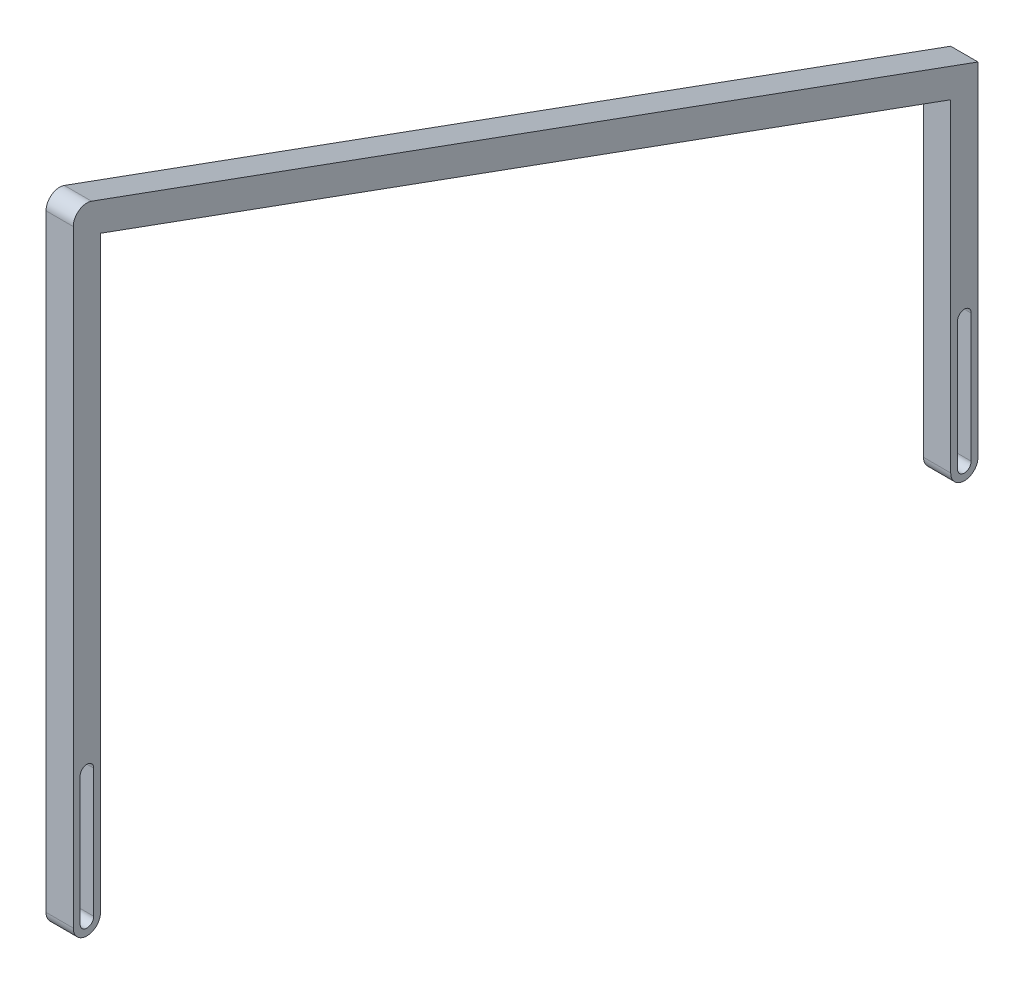
ISO-10303-21;
HEADER;
FILE_DESCRIPTION(('STEP AP214'),'2;1');
FILE_NAME('part.step','',(''),(''),'','','');
FILE_SCHEMA(('AUTOMOTIVE_DESIGN { 1 0 10303 214 1 1 1 1 }'));
ENDSEC;
DATA;
#1=APPLICATION_CONTEXT('core data for automotive mechanical design processes');
#2=APPLICATION_PROTOCOL_DEFINITION('international standard','automotive_design',2000,#1);
#3=PRODUCT_CONTEXT('',#1,'mechanical');
#4=PRODUCT('Part','Part','',(#3));
#5=PRODUCT_RELATED_PRODUCT_CATEGORY('part','',(#4));
#6=PRODUCT_DEFINITION_FORMATION('','',#4);
#7=PRODUCT_DEFINITION_CONTEXT('part definition',#1,'design');
#8=PRODUCT_DEFINITION('design','',#6,#7);
#9=PRODUCT_DEFINITION_SHAPE('','',#8);
#10=(LENGTH_UNIT() NAMED_UNIT(*) SI_UNIT(.MILLI.,.METRE.));
#11=(NAMED_UNIT(*) PLANE_ANGLE_UNIT() SI_UNIT($,.RADIAN.));
#12=(NAMED_UNIT(*) SI_UNIT($,.STERADIAN.) SOLID_ANGLE_UNIT());
#13=UNCERTAINTY_MEASURE_WITH_UNIT(LENGTH_MEASURE(1.E-05),#10,'distance_accuracy_value','');
#14=(GEOMETRIC_REPRESENTATION_CONTEXT(3) GLOBAL_UNCERTAINTY_ASSIGNED_CONTEXT((#13)) GLOBAL_UNIT_ASSIGNED_CONTEXT((#10,
#11,#12)) REPRESENTATION_CONTEXT('',''));
#15=CARTESIAN_POINT('',(0.,0.,0.));
#16=DIRECTION('',(0.,0.,1.));
#17=DIRECTION('',(1.,0.,0.));
#18=AXIS2_PLACEMENT_3D('',#15,#16,#17);
#19=CARTESIAN_POINT('',(-3.99999999999999,-169.443240014958,-232.412295168564));
#20=DIRECTION('',(1.,0.,0.));
#21=DIRECTION('',(0.,0.,-1.));
#22=AXIS2_PLACEMENT_3D('',#19,#20,#21);
#23=CYLINDRICAL_SURFACE('',#22,2.);
#24=CARTESIAN_POINT('',(4.00000000000001,-169.443240014958,-232.412295168564));
#25=DIRECTION('',(-1.,0.,0.));
#26=DIRECTION('',(0.,0.,1.));
#27=AXIS2_PLACEMENT_3D('',#24,#25,#26);
#28=CIRCLE('',#27,2.);
#29=CARTESIAN_POINT('',(4.00000000000001,-169.443240014958,-234.412295168564));
#30=VERTEX_POINT('',#29);
#31=CARTESIAN_POINT('',(4.00000000000001,-169.443240014958,-230.412295168564));
#32=VERTEX_POINT('',#31);
#33=EDGE_CURVE('E229',#30,#32,#28,.T.);
#34=ORIENTED_EDGE('',*,*,#33,.F.);
#35=DIRECTION('',(1.,0.,0.));
#36=VECTOR('',#35,1.);
#37=CARTESIAN_POINT('',(-3.99999999999999,-169.443240014958,-234.412295168564));
#38=LINE('',#37,#36);
#39=CARTESIAN_POINT('',(-3.99999999999999,-169.443240014958,-234.412295168564));
#40=VERTEX_POINT('',#39);
#41=EDGE_CURVE('E11',#40,#30,#38,.T.);
#42=ORIENTED_EDGE('',*,*,#41,.F.);
#43=CARTESIAN_POINT('',(-3.99999999999999,-169.443240014958,-232.412295168564));
#44=DIRECTION('',(-1.,0.,0.));
#45=DIRECTION('',(0.,0.,1.));
#46=AXIS2_PLACEMENT_3D('',#43,#44,#45);
#47=CIRCLE('',#46,2.);
#48=CARTESIAN_POINT('',(-3.99999999999999,-169.443240014958,-230.412295168564));
#49=VERTEX_POINT('',#48);
#50=EDGE_CURVE('E183',#40,#49,#47,.T.);
#51=ORIENTED_EDGE('',*,*,#50,.T.);
#52=DIRECTION('',(1.,0.,0.));
#53=VECTOR('',#52,1.);
#54=CARTESIAN_POINT('',(-3.99999999999999,-169.443240014958,-230.412295168564));
#55=LINE('',#54,#53);
#56=EDGE_CURVE('E118',#49,#32,#55,.T.);
#57=ORIENTED_EDGE('',*,*,#56,.T.);
#58=EDGE_LOOP('',(#34,#42,#51,#57));
#59=FACE_BOUND('',#58,.T.);
#60=ADVANCED_FACE('F37',(#59),#23,.F.);
#61=CARTESIAN_POINT('',(-3.99999999999999,0.,-234.412295168564));
#62=DIRECTION('',(0.,0.,1.));
#63=DIRECTION('',(1.,0.,0.));
#64=AXIS2_PLACEMENT_3D('',#61,#62,#63);
#65=PLANE('',#64);
#66=DIRECTION('',(0.,-1.,0.));
#67=VECTOR('',#66,1.);
#68=CARTESIAN_POINT('',(4.00000000000001,0.,-234.412295168564));
#69=LINE('',#68,#67);
#70=CARTESIAN_POINT('',(4.00000000000001,-131.821024249135,-234.412295168564));
#71=VERTEX_POINT('',#70);
#72=EDGE_CURVE('E173',#71,#30,#69,.T.);
#73=ORIENTED_EDGE('',*,*,#72,.F.);
#74=DIRECTION('',(1.,0.,0.));
#75=VECTOR('',#74,1.);
#76=CARTESIAN_POINT('',(-3.99999999999999,-131.821024249135,-234.412295168564));
#77=LINE('',#76,#75);
#78=CARTESIAN_POINT('',(-3.99999999999999,-131.821024249135,-234.412295168564));
#79=VERTEX_POINT('',#78);
#80=EDGE_CURVE('E47',#79,#71,#77,.T.);
#81=ORIENTED_EDGE('',*,*,#80,.F.);
#82=DIRECTION('',(0.,-1.,0.));
#83=VECTOR('',#82,1.);
#84=CARTESIAN_POINT('',(-3.99999999999999,0.,-234.412295168564));
#85=LINE('',#84,#83);
#86=EDGE_CURVE('E171',#79,#40,#85,.T.);
#87=ORIENTED_EDGE('',*,*,#86,.T.);
#88=ORIENTED_EDGE('',*,*,#41,.T.);
#89=EDGE_LOOP('',(#73,#81,#87,#88));
#90=FACE_BOUND('',#89,.T.);
#91=ADVANCED_FACE('F169',(#90),#65,.T.);
#92=CARTESIAN_POINT('',(-3.99999999999999,-131.821024249135,-232.412295168564));
#93=DIRECTION('',(1.,0.,0.));
#94=DIRECTION('',(0.,0.,-1.));
#95=AXIS2_PLACEMENT_3D('',#92,#93,#94);
#96=CYLINDRICAL_SURFACE('',#95,2.);
#97=CARTESIAN_POINT('',(4.00000000000001,-131.821024249135,-232.412295168564));
#98=DIRECTION('',(-1.,0.,0.));
#99=DIRECTION('',(0.,0.,1.));
#100=AXIS2_PLACEMENT_3D('',#97,#98,#99);
#101=CIRCLE('',#100,2.);
#102=CARTESIAN_POINT('',(4.00000000000001,-131.821024249135,-230.412295168564));
#103=VERTEX_POINT('',#102);
#104=EDGE_CURVE('E232',#71,#103,#101,.F.);
#105=ORIENTED_EDGE('',*,*,#104,.T.);
#106=DIRECTION('',(1.,0.,0.));
#107=VECTOR('',#106,1.);
#108=CARTESIAN_POINT('',(-3.99999999999999,-131.821024249135,-230.412295168564));
#109=LINE('',#108,#107);
#110=CARTESIAN_POINT('',(-3.99999999999999,-131.821024249135,-230.412295168564));
#111=VERTEX_POINT('',#110);
#112=EDGE_CURVE('E176',#111,#103,#109,.T.);
#113=ORIENTED_EDGE('',*,*,#112,.F.);
#114=CARTESIAN_POINT('',(-3.99999999999999,-131.821024249135,-232.412295168564));
#115=DIRECTION('',(-1.,0.,0.));
#116=DIRECTION('',(0.,0.,1.));
#117=AXIS2_PLACEMENT_3D('',#114,#115,#116);
#118=CIRCLE('',#117,2.);
#119=EDGE_CURVE('E179',#79,#111,#118,.F.);
#120=ORIENTED_EDGE('',*,*,#119,.F.);
#121=ORIENTED_EDGE('',*,*,#80,.T.);
#122=EDGE_LOOP('',(#105,#113,#120,#121));
#123=FACE_BOUND('',#122,.T.);
#124=ADVANCED_FACE('F180',(#123),#96,.F.);
#125=CARTESIAN_POINT('',(-3.99999999999999,21.8595940293963,24.973088192255));
#126=DIRECTION('',(1.,0.,0.));
#127=DIRECTION('',(0.,0.,-1.));
#128=AXIS2_PLACEMENT_3D('',#125,#126,#127);
#129=CYLINDRICAL_SURFACE('',#128,4.);
#130=CARTESIAN_POINT('',(4.00000000000001,21.8595940293963,24.973088192255));
#131=DIRECTION('',(-1.,0.,0.));
#132=DIRECTION('',(0.,0.,1.));
#133=AXIS2_PLACEMENT_3D('',#130,#131,#132);
#134=CIRCLE('',#133,4.);
#135=CARTESIAN_POINT('',(4.00000000000001,25.6183645125399,23.6050076189524));
#136=VERTEX_POINT('',#135);
#137=CARTESIAN_POINT('',(4.00000000000001,21.8595940293963,28.973088192255));
#138=VERTEX_POINT('',#137);
#139=EDGE_CURVE('E202',#136,#138,#134,.F.);
#140=ORIENTED_EDGE('',*,*,#139,.F.);
#141=DIRECTION('',(1.,0.,0.));
#142=VECTOR('',#141,1.);
#143=CARTESIAN_POINT('',(-3.99999999999999,25.6183645125399,23.6050076189524));
#144=LINE('',#143,#142);
#145=CARTESIAN_POINT('',(-3.99999999999999,25.6183645125399,23.6050076189524));
#146=VERTEX_POINT('',#145);
#147=EDGE_CURVE('E237',#146,#136,#144,.T.);
#148=ORIENTED_EDGE('',*,*,#147,.F.);
#149=CARTESIAN_POINT('',(-3.99999999999999,21.8595940293963,24.973088192255));
#150=DIRECTION('',(-1.,0.,0.));
#151=DIRECTION('',(0.,0.,1.));
#152=AXIS2_PLACEMENT_3D('',#149,#150,#151);
#153=CIRCLE('',#152,4.);
#154=CARTESIAN_POINT('',(-3.99999999999999,21.8595940293963,28.973088192255));
#155=VERTEX_POINT('',#154);
#156=EDGE_CURVE('E284',#146,#155,#153,.F.);
#157=ORIENTED_EDGE('',*,*,#156,.T.);
#158=DIRECTION('',(1.,0.,0.));
#159=VECTOR('',#158,1.);
#160=CARTESIAN_POINT('',(-3.99999999999999,21.8595940293963,28.973088192255));
#161=LINE('',#160,#159);
#162=EDGE_CURVE('E239',#155,#138,#161,.T.);
#163=ORIENTED_EDGE('',*,*,#162,.T.);
#164=EDGE_LOOP('',(#140,#148,#157,#163));
#165=FACE_BOUND('',#164,.T.);
#166=ADVANCED_FACE('F327',(#165),#129,.T.);
#167=CARTESIAN_POINT('',(-3.99999999999999,15.0350819325745,-5.47232229321059));
#168=DIRECTION('',(0.,-0.939692620785911,0.342020143325663));
#169=DIRECTION('',(0.,-0.342020143325663,-0.939692620785911));
#170=AXIS2_PLACEMENT_3D('',#167,#168,#169);
#171=PLANE('',#170);
#172=DIRECTION('',(0.,-0.342020143325663,-0.939692620785911));
#173=VECTOR('',#172,1.);
#174=CARTESIAN_POINT('',(4.00000000000001,15.0350819325745,-5.47232229321059));
#175=LINE('',#174,#173);
#176=CARTESIAN_POINT('',(4.00000000000001,-69.0201940962964,-236.412295168564));
#177=VERTEX_POINT('',#176);
#178=EDGE_CURVE('E205',#136,#177,#175,.T.);
#179=ORIENTED_EDGE('',*,*,#178,.T.);
#180=DIRECTION('',(1.,0.,0.));
#181=VECTOR('',#180,1.);
#182=CARTESIAN_POINT('',(-3.99999999999999,-69.0201940962964,-236.412295168564));
#183=LINE('',#182,#181);
#184=CARTESIAN_POINT('',(-3.99999999999999,-69.0201940962964,-236.412295168564));
#185=VERTEX_POINT('',#184);
#186=EDGE_CURVE('E255',#185,#177,#183,.T.);
#187=ORIENTED_EDGE('',*,*,#186,.F.);
#188=DIRECTION('',(0.,-0.342020143325663,-0.939692620785911));
#189=VECTOR('',#188,1.);
#190=CARTESIAN_POINT('',(-3.99999999999999,15.0350819325745,-5.47232229321059));
#191=LINE('',#190,#189);
#192=EDGE_CURVE('E288',#146,#185,#191,.T.);
#193=ORIENTED_EDGE('',*,*,#192,.F.);
#194=ORIENTED_EDGE('',*,*,#147,.T.);
#195=EDGE_LOOP('',(#179,#187,#193,#194));
#196=FACE_BOUND('',#195,.T.);
#197=ADVANCED_FACE('F331',(#196),#171,.F.);
#198=CARTESIAN_POINT('',(-3.99999999999999,-1.04485232425209E-13,-236.412295168564));
#199=DIRECTION('',(0.,0.,1.));
#200=DIRECTION('',(0.,-1.,0.));
#201=AXIS2_PLACEMENT_3D('',#198,#199,#200);
#202=PLANE('',#201);
#203=DIRECTION('',(0.,-1.,0.));
#204=VECTOR('',#203,1.);
#205=CARTESIAN_POINT('',(4.00000000000001,-1.04485232425209E-13,-236.412295168564));
#206=LINE('',#205,#204);
#207=CARTESIAN_POINT('',(4.00000000000001,-169.443240014958,-236.412295168564));
#208=VERTEX_POINT('',#207);
#209=EDGE_CURVE('E208',#177,#208,#206,.T.);
#210=ORIENTED_EDGE('',*,*,#209,.T.);
#211=DIRECTION('',(1.,0.,0.));
#212=VECTOR('',#211,1.);
#213=CARTESIAN_POINT('',(-3.99999999999999,-169.443240014958,-236.412295168564));
#214=LINE('',#213,#212);
#215=CARTESIAN_POINT('',(-3.99999999999999,-169.443240014958,-236.412295168564));
#216=VERTEX_POINT('',#215);
#217=EDGE_CURVE('E252',#216,#208,#214,.T.);
#218=ORIENTED_EDGE('',*,*,#217,.F.);
#219=DIRECTION('',(0.,-1.,0.));
#220=VECTOR('',#219,1.);
#221=CARTESIAN_POINT('',(-3.99999999999999,-1.04485232425209E-13,-236.412295168564));
#222=LINE('',#221,#220);
#223=EDGE_CURVE('E295',#185,#216,#222,.T.);
#224=ORIENTED_EDGE('',*,*,#223,.F.);
#225=ORIENTED_EDGE('',*,*,#186,.T.);
#226=EDGE_LOOP('',(#210,#218,#224,#225));
#227=FACE_BOUND('',#226,.T.);
#228=ADVANCED_FACE('F336',(#227),#202,.F.);
#229=CARTESIAN_POINT('',(-3.99999999999999,-169.443240014958,-232.412295168564));
#230=DIRECTION('',(1.,0.,0.));
#231=DIRECTION('',(0.,0.,-1.));
#232=AXIS2_PLACEMENT_3D('',#229,#230,#231);
#233=CYLINDRICAL_SURFACE('',#232,4.);
#234=CARTESIAN_POINT('',(4.00000000000001,-169.443240014958,-232.412295168564));
#235=DIRECTION('',(-1.,0.,0.));
#236=DIRECTION('',(0.,0.,1.));
#237=AXIS2_PLACEMENT_3D('',#234,#235,#236);
#238=CIRCLE('',#237,4.);
#239=CARTESIAN_POINT('',(4.00000000000001,-169.443240014958,-228.412295168564));
#240=VERTEX_POINT('',#239);
#241=EDGE_CURVE('E211',#208,#240,#238,.T.);
#242=ORIENTED_EDGE('',*,*,#241,.T.);
#243=DIRECTION('',(1.,0.,0.));
#244=VECTOR('',#243,1.);
#245=CARTESIAN_POINT('',(-3.99999999999999,-169.443240014958,-228.412295168564));
#246=LINE('',#245,#244);
#247=CARTESIAN_POINT('',(-3.99999999999999,-169.443240014958,-228.412295168564));
#248=VERTEX_POINT('',#247);
#249=EDGE_CURVE('E250',#248,#240,#246,.T.);
#250=ORIENTED_EDGE('',*,*,#249,.F.);
#251=CARTESIAN_POINT('',(-3.99999999999999,-169.443240014958,-232.412295168564));
#252=DIRECTION('',(-1.,0.,0.));
#253=DIRECTION('',(0.,0.,1.));
#254=AXIS2_PLACEMENT_3D('',#251,#252,#253);
#255=CIRCLE('',#254,4.);
#256=EDGE_CURVE('E298',#216,#248,#255,.T.);
#257=ORIENTED_EDGE('',*,*,#256,.F.);
#258=ORIENTED_EDGE('',*,*,#217,.T.);
#259=EDGE_LOOP('',(#242,#250,#257,#258));
#260=FACE_BOUND('',#259,.T.);
#261=ADVANCED_FACE('F338',(#260),#233,.T.);
#262=CARTESIAN_POINT('',(-3.99999999999999,0.,-228.412295168564));
#263=DIRECTION('',(0.,0.,1.));
#264=DIRECTION('',(1.,0.,0.));
#265=AXIS2_PLACEMENT_3D('',#262,#263,#264);
#266=PLANE('',#265);
#267=DIRECTION('',(0.,-1.,0.));
#268=VECTOR('',#267,1.);
#269=CARTESIAN_POINT('',(4.00000000000001,0.,-228.412295168564));
#270=LINE('',#269,#268);
#271=CARTESIAN_POINT('',(4.00000000000001,-74.6218544019741,-228.412295168564));
#272=VERTEX_POINT('',#271);
#273=EDGE_CURVE('E214',#272,#240,#270,.T.);
#274=ORIENTED_EDGE('',*,*,#273,.F.);
#275=DIRECTION('',(1.,0.,0.));
#276=VECTOR('',#275,1.);
#277=CARTESIAN_POINT('',(-3.99999999999999,-74.6218544019741,-228.412295168564));
#278=LINE('',#277,#276);
#279=CARTESIAN_POINT('',(-3.99999999999999,-74.6218544019741,-228.412295168564));
#280=VERTEX_POINT('',#279);
#281=EDGE_CURVE('E248',#280,#272,#278,.T.);
#282=ORIENTED_EDGE('',*,*,#281,.F.);
#283=DIRECTION('',(0.,-1.,0.));
#284=VECTOR('',#283,1.);
#285=CARTESIAN_POINT('',(-3.99999999999999,0.,-228.412295168564));
#286=LINE('',#285,#284);
#287=EDGE_CURVE('E300',#280,#248,#286,.T.);
#288=ORIENTED_EDGE('',*,*,#287,.T.);
#289=ORIENTED_EDGE('',*,*,#249,.T.);
#290=EDGE_LOOP('',(#274,#282,#288,#289));
#291=FACE_BOUND('',#290,.T.);
#292=ADVANCED_FACE('F341',(#291),#266,.T.);
#293=CARTESIAN_POINT('',(-3.99999999999999,7.51754096628725,-2.73616114660529));
#294=DIRECTION('',(0.,-0.939692620785911,0.342020143325663));
#295=DIRECTION('',(0.,-0.342020143325663,-0.939692620785911));
#296=AXIS2_PLACEMENT_3D('',#293,#294,#295);
#297=PLANE('',#296);
#298=DIRECTION('',(0.,-0.342020143325663,-0.939692620785911));
#299=VECTOR('',#298,1.);
#300=CARTESIAN_POINT('',(4.00000000000001,7.51754096628725,-2.73616114660529));
#301=LINE('',#300,#299);
#302=CARTESIAN_POINT('',(4.00000000000001,16.1470020024279,20.973088192255));
#303=VERTEX_POINT('',#302);
#304=EDGE_CURVE('E217',#303,#272,#301,.T.);
#305=ORIENTED_EDGE('',*,*,#304,.F.);
#306=DIRECTION('',(1.,0.,0.));
#307=VECTOR('',#306,1.);
#308=CARTESIAN_POINT('',(-3.99999999999999,16.1470020024279,20.973088192255));
#309=LINE('',#308,#307);
#310=CARTESIAN_POINT('',(-3.99999999999999,16.1470020024279,20.973088192255));
#311=VERTEX_POINT('',#310);
#312=EDGE_CURVE('E246',#311,#303,#309,.T.);
#313=ORIENTED_EDGE('',*,*,#312,.F.);
#314=DIRECTION('',(0.,-0.342020143325663,-0.939692620785911));
#315=VECTOR('',#314,1.);
#316=CARTESIAN_POINT('',(-3.99999999999999,7.51754096628725,-2.73616114660529));
#317=LINE('',#316,#315);
#318=EDGE_CURVE('E303',#311,#280,#317,.T.);
#319=ORIENTED_EDGE('',*,*,#318,.T.);
#320=ORIENTED_EDGE('',*,*,#281,.T.);
#321=EDGE_LOOP('',(#305,#313,#319,#320));
#322=FACE_BOUND('',#321,.T.);
#323=ADVANCED_FACE('F344',(#322),#297,.T.);
#324=CARTESIAN_POINT('',(-3.99999999999999,0.,20.973088192255));
#325=DIRECTION('',(0.,0.,1.));
#326=DIRECTION('',(0.,-1.,0.));
#327=AXIS2_PLACEMENT_3D('',#324,#325,#326);
#328=PLANE('',#327);
#329=DIRECTION('',(0.,-1.,0.));
#330=VECTOR('',#329,1.);
#331=CARTESIAN_POINT('',(4.00000000000001,0.,20.973088192255));
#332=LINE('',#331,#330);
#333=CARTESIAN_POINT('',(4.00000000000001,-156.353912478274,20.973088192255));
#334=VERTEX_POINT('',#333);
#335=EDGE_CURVE('E220',#303,#334,#332,.T.);
#336=ORIENTED_EDGE('',*,*,#335,.T.);
#337=DIRECTION('',(1.,0.,0.));
#338=VECTOR('',#337,1.);
#339=CARTESIAN_POINT('',(-3.99999999999999,-156.353912478274,20.973088192255));
#340=LINE('',#339,#338);
#341=CARTESIAN_POINT('',(-3.99999999999999,-156.353912478274,20.973088192255));
#342=VERTEX_POINT('',#341);
#343=EDGE_CURVE('E243',#342,#334,#340,.T.);
#344=ORIENTED_EDGE('',*,*,#343,.F.);
#345=DIRECTION('',(0.,-1.,0.));
#346=VECTOR('',#345,1.);
#347=CARTESIAN_POINT('',(-3.99999999999999,0.,20.973088192255));
#348=LINE('',#347,#346);
#349=EDGE_CURVE('E306',#311,#342,#348,.T.);
#350=ORIENTED_EDGE('',*,*,#349,.F.);
#351=ORIENTED_EDGE('',*,*,#312,.T.);
#352=EDGE_LOOP('',(#336,#344,#350,#351));
#353=FACE_BOUND('',#352,.T.);
#354=ADVANCED_FACE('F346',(#353),#328,.F.);
#355=CARTESIAN_POINT('',(-3.99999999999999,-156.353912478274,24.973088192255));
#356=DIRECTION('',(1.,0.,0.));
#357=DIRECTION('',(0.,0.,-1.));
#358=AXIS2_PLACEMENT_3D('',#355,#356,#357);
#359=CYLINDRICAL_SURFACE('',#358,4.);
#360=CARTESIAN_POINT('',(4.00000000000001,-156.353912478274,24.973088192255));
#361=DIRECTION('',(-1.,0.,0.));
#362=DIRECTION('',(0.,0.,1.));
#363=AXIS2_PLACEMENT_3D('',#360,#361,#362);
#364=CIRCLE('',#363,4.);
#365=CARTESIAN_POINT('',(4.00000000000001,-156.353912478274,28.973088192255));
#366=VERTEX_POINT('',#365);
#367=EDGE_CURVE('E223',#334,#366,#364,.T.);
#368=ORIENTED_EDGE('',*,*,#367,.T.);
#369=DIRECTION('',(1.,0.,0.));
#370=VECTOR('',#369,1.);
#371=CARTESIAN_POINT('',(-3.99999999999999,-156.353912478274,28.973088192255));
#372=LINE('',#371,#370);
#373=CARTESIAN_POINT('',(-3.99999999999999,-156.353912478274,28.973088192255));
#374=VERTEX_POINT('',#373);
#375=EDGE_CURVE('E241',#374,#366,#372,.T.);
#376=ORIENTED_EDGE('',*,*,#375,.F.);
#377=CARTESIAN_POINT('',(-3.99999999999999,-156.353912478274,24.973088192255));
#378=DIRECTION('',(-1.,0.,0.));
#379=DIRECTION('',(0.,0.,1.));
#380=AXIS2_PLACEMENT_3D('',#377,#378,#379);
#381=CIRCLE('',#380,4.);
#382=EDGE_CURVE('E309',#342,#374,#381,.T.);
#383=ORIENTED_EDGE('',*,*,#382,.F.);
#384=ORIENTED_EDGE('',*,*,#343,.T.);
#385=EDGE_LOOP('',(#368,#376,#383,#384));
#386=FACE_BOUND('',#385,.T.);
#387=ADVANCED_FACE('F322',(#386),#359,.T.);
#388=CARTESIAN_POINT('',(-3.99999999999999,-156.353912478274,24.973088192255));
#389=DIRECTION('',(1.,0.,0.));
#390=DIRECTION('',(0.,0.,-1.));
#391=AXIS2_PLACEMENT_3D('',#388,#389,#390);
#392=CYLINDRICAL_SURFACE('',#391,2.);
#393=CARTESIAN_POINT('',(4.00000000000001,-156.353912478274,24.973088192255));
#394=DIRECTION('',(-1.,0.,0.));
#395=DIRECTION('',(0.,0.,1.));
#396=AXIS2_PLACEMENT_3D('',#393,#394,#395);
#397=CIRCLE('',#396,2.);
#398=CARTESIAN_POINT('',(4.00000000000001,-156.353912478274,22.973088192255));
#399=VERTEX_POINT('',#398);
#400=CARTESIAN_POINT('',(4.00000000000001,-156.353912478274,26.973088192255));
#401=VERTEX_POINT('',#400);
#402=EDGE_CURVE('E191',#399,#401,#397,.T.);
#403=ORIENTED_EDGE('',*,*,#402,.F.);
#404=DIRECTION('',(1.,0.,0.));
#405=VECTOR('',#404,1.);
#406=CARTESIAN_POINT('',(-3.99999999999999,-156.353912478274,22.973088192255));
#407=LINE('',#406,#405);
#408=CARTESIAN_POINT('',(-3.99999999999999,-156.353912478274,22.973088192255));
#409=VERTEX_POINT('',#408);
#410=EDGE_CURVE('E41',#409,#399,#407,.T.);
#411=ORIENTED_EDGE('',*,*,#410,.F.);
#412=CARTESIAN_POINT('',(-3.99999999999999,-156.353912478274,24.973088192255));
#413=DIRECTION('',(-1.,0.,0.));
#414=DIRECTION('',(0.,0.,1.));
#415=AXIS2_PLACEMENT_3D('',#412,#413,#414);
#416=CIRCLE('',#415,2.);
#417=CARTESIAN_POINT('',(-3.99999999999999,-156.353912478274,26.973088192255));
#418=VERTEX_POINT('',#417);
#419=EDGE_CURVE('E235',#409,#418,#416,.T.);
#420=ORIENTED_EDGE('',*,*,#419,.T.);
#421=DIRECTION('',(1.,0.,0.));
#422=VECTOR('',#421,1.);
#423=CARTESIAN_POINT('',(-3.99999999999999,-156.353912478274,26.973088192255));
#424=LINE('',#423,#422);
#425=EDGE_CURVE('E190',#418,#401,#424,.T.);
#426=ORIENTED_EDGE('',*,*,#425,.T.);
#427=EDGE_LOOP('',(#403,#411,#420,#426));
#428=FACE_BOUND('',#427,.T.);
#429=ADVANCED_FACE('F39',(#428),#392,.F.);
#430=CARTESIAN_POINT('',(-3.99999999999999,0.,22.973088192255));
#431=DIRECTION('',(0.,0.,1.));
#432=DIRECTION('',(1.,0.,0.));
#433=AXIS2_PLACEMENT_3D('',#430,#431,#432);
#434=PLANE('',#433);
#435=DIRECTION('',(0.,-1.,0.));
#436=VECTOR('',#435,1.);
#437=CARTESIAN_POINT('',(4.00000000000001,0.,22.973088192255));
#438=LINE('',#437,#436);
#439=CARTESIAN_POINT('',(4.00000000000001,-118.731696712451,22.973088192255));
#440=VERTEX_POINT('',#439);
#441=EDGE_CURVE('E194',#440,#399,#438,.T.);
#442=ORIENTED_EDGE('',*,*,#441,.F.);
#443=DIRECTION('',(1.,0.,0.));
#444=VECTOR('',#443,1.);
#445=CARTESIAN_POINT('',(-3.99999999999999,-118.731696712451,22.973088192255));
#446=LINE('',#445,#444);
#447=CARTESIAN_POINT('',(-3.99999999999999,-118.731696712451,22.973088192255));
#448=VERTEX_POINT('',#447);
#449=EDGE_CURVE('E262',#448,#440,#446,.T.);
#450=ORIENTED_EDGE('',*,*,#449,.F.);
#451=DIRECTION('',(0.,-1.,0.));
#452=VECTOR('',#451,1.);
#453=CARTESIAN_POINT('',(-3.99999999999999,0.,22.973088192255));
#454=LINE('',#453,#452);
#455=EDGE_CURVE('E271',#448,#409,#454,.T.);
#456=ORIENTED_EDGE('',*,*,#455,.T.);
#457=ORIENTED_EDGE('',*,*,#410,.T.);
#458=EDGE_LOOP('',(#442,#450,#456,#457));
#459=FACE_BOUND('',#458,.T.);
#460=ADVANCED_FACE('F269',(#459),#434,.T.);
#461=CARTESIAN_POINT('',(-3.99999999999999,-118.731696712451,24.973088192255));
#462=DIRECTION('',(1.,0.,0.));
#463=DIRECTION('',(0.,0.,-1.));
#464=AXIS2_PLACEMENT_3D('',#461,#462,#463);
#465=CYLINDRICAL_SURFACE('',#464,2.);
#466=CARTESIAN_POINT('',(4.00000000000001,-118.731696712451,24.973088192255));
#467=DIRECTION('',(-1.,0.,0.));
#468=DIRECTION('',(0.,0.,1.));
#469=AXIS2_PLACEMENT_3D('',#466,#467,#468);
#470=CIRCLE('',#469,2.);
#471=CARTESIAN_POINT('',(4.00000000000001,-118.731696712451,26.973088192255));
#472=VERTEX_POINT('',#471);
#473=EDGE_CURVE('E197',#440,#472,#470,.F.);
#474=ORIENTED_EDGE('',*,*,#473,.T.);
#475=DIRECTION('',(1.,0.,0.));
#476=VECTOR('',#475,1.);
#477=CARTESIAN_POINT('',(-3.99999999999999,-118.731696712451,26.973088192255));
#478=LINE('',#477,#476);
#479=CARTESIAN_POINT('',(-3.99999999999999,-118.731696712451,26.973088192255));
#480=VERTEX_POINT('',#479);
#481=EDGE_CURVE('E260',#480,#472,#478,.T.);
#482=ORIENTED_EDGE('',*,*,#481,.F.);
#483=CARTESIAN_POINT('',(-3.99999999999999,-118.731696712451,24.973088192255));
#484=DIRECTION('',(-1.,0.,0.));
#485=DIRECTION('',(0.,0.,1.));
#486=AXIS2_PLACEMENT_3D('',#483,#484,#485);
#487=CIRCLE('',#486,2.);
#488=EDGE_CURVE('E285',#448,#480,#487,.F.);
#489=ORIENTED_EDGE('',*,*,#488,.F.);
#490=ORIENTED_EDGE('',*,*,#449,.T.);
#491=EDGE_LOOP('',(#474,#482,#489,#490));
#492=FACE_BOUND('',#491,.T.);
#493=ADVANCED_FACE('F278',(#492),#465,.F.);
#494=CARTESIAN_POINT('',(-3.99999999999999,0.,28.973088192255));
#495=DIRECTION('',(0.,0.,1.));
#496=DIRECTION('',(0.,-1.,0.));
#497=AXIS2_PLACEMENT_3D('',#494,#495,#496);
#498=PLANE('',#497);
#499=DIRECTION('',(0.,-1.,0.));
#500=VECTOR('',#499,1.);
#501=CARTESIAN_POINT('',(4.00000000000001,0.,28.973088192255));
#502=LINE('',#501,#500);
#503=EDGE_CURVE('E226',#138,#366,#502,.T.);
#504=ORIENTED_EDGE('',*,*,#503,.F.);
#505=ORIENTED_EDGE('',*,*,#162,.F.);
#506=DIRECTION('',(0.,-1.,0.));
#507=VECTOR('',#506,1.);
#508=CARTESIAN_POINT('',(-3.99999999999999,0.,28.973088192255));
#509=LINE('',#508,#507);
#510=EDGE_CURVE('E185',#155,#374,#509,.T.);
#511=ORIENTED_EDGE('',*,*,#510,.T.);
#512=ORIENTED_EDGE('',*,*,#375,.T.);
#513=EDGE_LOOP('',(#504,#505,#511,#512));
#514=FACE_BOUND('',#513,.T.);
#515=ADVANCED_FACE('F314',(#514),#498,.T.);
#516=CARTESIAN_POINT('',(-3.99999999999999,0.,26.973088192255));
#517=DIRECTION('',(0.,0.,1.));
#518=DIRECTION('',(0.,-1.,0.));
#519=AXIS2_PLACEMENT_3D('',#516,#517,#518);
#520=PLANE('',#519);
#521=DIRECTION('',(0.,-1.,0.));
#522=VECTOR('',#521,1.);
#523=CARTESIAN_POINT('',(4.00000000000001,0.,26.973088192255));
#524=LINE('',#523,#522);
#525=EDGE_CURVE('E199',#472,#401,#524,.T.);
#526=ORIENTED_EDGE('',*,*,#525,.T.);
#527=ORIENTED_EDGE('',*,*,#425,.F.);
#528=DIRECTION('',(0.,-1.,0.));
#529=VECTOR('',#528,1.);
#530=CARTESIAN_POINT('',(-3.99999999999999,0.,26.973088192255));
#531=LINE('',#530,#529);
#532=EDGE_CURVE('E282',#480,#418,#531,.T.);
#533=ORIENTED_EDGE('',*,*,#532,.F.);
#534=ORIENTED_EDGE('',*,*,#481,.T.);
#535=EDGE_LOOP('',(#526,#527,#533,#534));
#536=FACE_BOUND('',#535,.T.);
#537=ADVANCED_FACE('F281',(#536),#520,.F.);
#538=CARTESIAN_POINT('',(-3.99999999999999,0.,-230.412295168564));
#539=DIRECTION('',(0.,0.,1.));
#540=DIRECTION('',(1.,0.,0.));
#541=AXIS2_PLACEMENT_3D('',#538,#539,#540);
#542=PLANE('',#541);
#543=DIRECTION('',(0.,-1.,0.));
#544=VECTOR('',#543,1.);
#545=CARTESIAN_POINT('',(4.00000000000001,0.,-230.412295168564));
#546=LINE('',#545,#544);
#547=EDGE_CURVE('E111',#103,#32,#546,.T.);
#548=ORIENTED_EDGE('',*,*,#547,.T.);
#549=ORIENTED_EDGE('',*,*,#56,.F.);
#550=DIRECTION('',(0.,-1.,0.));
#551=VECTOR('',#550,1.);
#552=CARTESIAN_POINT('',(-3.99999999999999,0.,-230.412295168564));
#553=LINE('',#552,#551);
#554=EDGE_CURVE('E56',#111,#49,#553,.T.);
#555=ORIENTED_EDGE('',*,*,#554,.F.);
#556=ORIENTED_EDGE('',*,*,#112,.T.);
#557=EDGE_LOOP('',(#548,#549,#555,#556));
#558=FACE_BOUND('',#557,.T.);
#559=ADVANCED_FACE('F368',(#558),#542,.F.);
#560=CARTESIAN_POINT('',(-3.99999999999999,0.,0.));
#561=DIRECTION('',(-1.,0.,0.));
#562=DIRECTION('',(0.,0.,1.));
#563=AXIS2_PLACEMENT_3D('',#560,#561,#562);
#564=PLANE('',#563);
#565=ORIENTED_EDGE('',*,*,#419,.F.);
#566=ORIENTED_EDGE('',*,*,#455,.F.);
#567=ORIENTED_EDGE('',*,*,#488,.T.);
#568=ORIENTED_EDGE('',*,*,#532,.T.);
#569=EDGE_LOOP('',(#565,#566,#567,#568));
#570=FACE_BOUND('',#569,.T.);
#571=ORIENTED_EDGE('',*,*,#156,.F.);
#572=ORIENTED_EDGE('',*,*,#192,.T.);
#573=ORIENTED_EDGE('',*,*,#223,.T.);
#574=ORIENTED_EDGE('',*,*,#256,.T.);
#575=ORIENTED_EDGE('',*,*,#287,.F.);
#576=ORIENTED_EDGE('',*,*,#318,.F.);
#577=ORIENTED_EDGE('',*,*,#349,.T.);
#578=ORIENTED_EDGE('',*,*,#382,.T.);
#579=ORIENTED_EDGE('',*,*,#510,.F.);
#580=EDGE_LOOP('',(#571,#572,#573,#574,#575,#576,#577,#578,#579));
#581=FACE_BOUND('',#580,.T.);
#582=ORIENTED_EDGE('',*,*,#50,.F.);
#583=ORIENTED_EDGE('',*,*,#86,.F.);
#584=ORIENTED_EDGE('',*,*,#119,.T.);
#585=ORIENTED_EDGE('',*,*,#554,.T.);
#586=EDGE_LOOP('',(#582,#583,#584,#585));
#587=FACE_BOUND('',#586,.T.);
#588=ADVANCED_FACE('F182',(#570,#581,#587),#564,.T.);
#589=CARTESIAN_POINT('',(4.00000000000001,0.,0.));
#590=DIRECTION('',(-1.,0.,0.));
#591=DIRECTION('',(0.,0.,1.));
#592=AXIS2_PLACEMENT_3D('',#589,#590,#591);
#593=PLANE('',#592);
#594=ORIENTED_EDGE('',*,*,#402,.T.);
#595=ORIENTED_EDGE('',*,*,#525,.F.);
#596=ORIENTED_EDGE('',*,*,#473,.F.);
#597=ORIENTED_EDGE('',*,*,#441,.T.);
#598=EDGE_LOOP('',(#594,#595,#596,#597));
#599=FACE_BOUND('',#598,.T.);
#600=ORIENTED_EDGE('',*,*,#139,.T.);
#601=ORIENTED_EDGE('',*,*,#503,.T.);
#602=ORIENTED_EDGE('',*,*,#367,.F.);
#603=ORIENTED_EDGE('',*,*,#335,.F.);
#604=ORIENTED_EDGE('',*,*,#304,.T.);
#605=ORIENTED_EDGE('',*,*,#273,.T.);
#606=ORIENTED_EDGE('',*,*,#241,.F.);
#607=ORIENTED_EDGE('',*,*,#209,.F.);
#608=ORIENTED_EDGE('',*,*,#178,.F.);
#609=EDGE_LOOP('',(#600,#601,#602,#603,#604,#605,#606,#607,#608));
#610=FACE_BOUND('',#609,.T.);
#611=ORIENTED_EDGE('',*,*,#33,.T.);
#612=ORIENTED_EDGE('',*,*,#547,.F.);
#613=ORIENTED_EDGE('',*,*,#104,.F.);
#614=ORIENTED_EDGE('',*,*,#72,.T.);
#615=EDGE_LOOP('',(#611,#612,#613,#614));
#616=FACE_BOUND('',#615,.T.);
#617=ADVANCED_FACE('F275',(#599,#610,#616),#593,.F.);
#618=CLOSED_SHELL('',(#60,#91,#124,#166,#197,#228,#261,#292,#323,#354,#387,#429,#460,#493,#515,
#537,#559,#588,#617));
#619=MANIFOLD_SOLID_BREP('B2',#618);
#620=ADVANCED_BREP_SHAPE_REPRESENTATION('',(#18,#619),#14);
#621=SHAPE_DEFINITION_REPRESENTATION(#9,#620);
ENDSEC;
END-ISO-10303-21;
